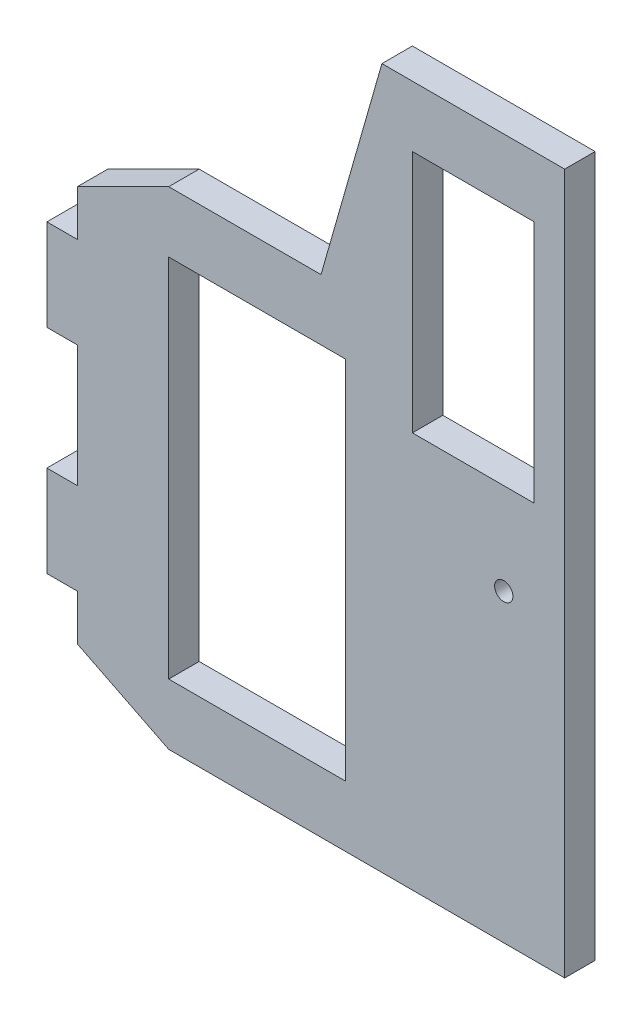
ISO-10303-21;
HEADER;
FILE_DESCRIPTION(('STEP AP214'),'2;1');
FILE_NAME('part.step','',(''),(''),'','','');
FILE_SCHEMA(('AUTOMOTIVE_DESIGN { 1 0 10303 214 1 1 1 1 }'));
ENDSEC;
DATA;
#1=APPLICATION_CONTEXT('core data for automotive mechanical design processes');
#2=APPLICATION_PROTOCOL_DEFINITION('international standard','automotive_design',2000,#1);
#3=PRODUCT_CONTEXT('',#1,'mechanical');
#4=PRODUCT('Part','Part','',(#3));
#5=PRODUCT_RELATED_PRODUCT_CATEGORY('part','',(#4));
#6=PRODUCT_DEFINITION_FORMATION('','',#4);
#7=PRODUCT_DEFINITION_CONTEXT('part definition',#1,'design');
#8=PRODUCT_DEFINITION('design','',#6,#7);
#9=PRODUCT_DEFINITION_SHAPE('','',#8);
#10=(LENGTH_UNIT() NAMED_UNIT(*) SI_UNIT(.MILLI.,.METRE.));
#11=(NAMED_UNIT(*) PLANE_ANGLE_UNIT() SI_UNIT($,.RADIAN.));
#12=(NAMED_UNIT(*) SI_UNIT($,.STERADIAN.) SOLID_ANGLE_UNIT());
#13=UNCERTAINTY_MEASURE_WITH_UNIT(LENGTH_MEASURE(1.E-05),#10,'distance_accuracy_value','');
#14=(GEOMETRIC_REPRESENTATION_CONTEXT(3) GLOBAL_UNCERTAINTY_ASSIGNED_CONTEXT((#13)) GLOBAL_UNIT_ASSIGNED_CONTEXT((#10,
#11,#12)) REPRESENTATION_CONTEXT('',''));
#15=CARTESIAN_POINT('',(0.,0.,0.));
#16=DIRECTION('',(0.,0.,1.));
#17=DIRECTION('',(1.,0.,0.));
#18=AXIS2_PLACEMENT_3D('',#15,#16,#17);
#19=CARTESIAN_POINT('',(-40.,31.7837837837838,5.));
#20=DIRECTION('',(1.,0.,0.));
#21=DIRECTION('',(0.,0.,-1.));
#22=AXIS2_PLACEMENT_3D('',#19,#20,#21);
#23=PLANE('',#22);
#24=DIRECTION('',(0.,-1.,0.));
#25=VECTOR('',#24,1.);
#26=CARTESIAN_POINT('',(-40.,31.7837837837838,0.));
#27=LINE('',#26,#25);
#28=CARTESIAN_POINT('',(-40.,-33.2162162162162,0.));
#29=VERTEX_POINT('',#28);
#30=CARTESIAN_POINT('',(-40.,-40.7162162162162,0.));
#31=VERTEX_POINT('',#30);
#32=EDGE_CURVE('E227',#29,#31,#27,.T.);
#33=ORIENTED_EDGE('',*,*,#32,.T.);
#34=DIRECTION('',(0.,0.,1.));
#35=VECTOR('',#34,1.);
#36=CARTESIAN_POINT('',(-40.,-40.7162162162162,0.));
#37=LINE('',#36,#35);
#38=CARTESIAN_POINT('',(-40.,-40.7162162162162,5.));
#39=VERTEX_POINT('',#38);
#40=EDGE_CURVE('E55',#31,#39,#37,.T.);
#41=ORIENTED_EDGE('',*,*,#40,.T.);
#42=DIRECTION('',(0.,-1.,0.));
#43=VECTOR('',#42,1.);
#44=CARTESIAN_POINT('',(-40.,31.7837837837838,5.));
#45=LINE('',#44,#43);
#46=CARTESIAN_POINT('',(-40.,-33.2162162162162,5.));
#47=VERTEX_POINT('',#46);
#48=EDGE_CURVE('E308',#47,#39,#45,.T.);
#49=ORIENTED_EDGE('',*,*,#48,.F.);
#50=DIRECTION('',(0.,0.,1.));
#51=VECTOR('',#50,1.);
#52=CARTESIAN_POINT('',(-40.,-33.2162162162162,0.));
#53=LINE('',#52,#51);
#54=EDGE_CURVE('E393',#29,#47,#53,.T.);
#55=ORIENTED_EDGE('',*,*,#54,.F.);
#56=EDGE_LOOP('',(#33,#41,#49,#55));
#57=FACE_BOUND('',#56,.T.);
#58=ADVANCED_FACE('F39',(#57),#23,.F.);
#59=DIRECTION('',(0.,0.,-1.));
#60=VECTOR('',#59,1.);
#61=CARTESIAN_POINT('',(-40.,-18.2162162162162,0.));
#62=LINE('',#61,#60);
#63=CARTESIAN_POINT('',(-40.,-18.2162162162162,5.));
#64=VERTEX_POINT('',#63);
#65=CARTESIAN_POINT('',(-40.,-18.2162162162162,0.));
#66=VERTEX_POINT('',#65);
#67=EDGE_CURVE('E383',#64,#66,#62,.T.);
#68=ORIENTED_EDGE('',*,*,#67,.F.);
#69=CARTESIAN_POINT('',(-40.,1.7837837837838,5.));
#70=VERTEX_POINT('',#69);
#71=EDGE_CURVE('E307',#70,#64,#45,.T.);
#72=ORIENTED_EDGE('',*,*,#71,.F.);
#73=DIRECTION('',(0.,0.,1.));
#74=VECTOR('',#73,1.);
#75=CARTESIAN_POINT('',(-40.,1.7837837837838,0.));
#76=LINE('',#75,#74);
#77=CARTESIAN_POINT('',(-40.,1.7837837837838,0.));
#78=VERTEX_POINT('',#77);
#79=EDGE_CURVE('E415',#78,#70,#76,.T.);
#80=ORIENTED_EDGE('',*,*,#79,.F.);
#81=EDGE_CURVE('E225',#78,#66,#27,.T.);
#82=ORIENTED_EDGE('',*,*,#81,.T.);
#83=EDGE_LOOP('',(#68,#72,#80,#82));
#84=FACE_BOUND('',#83,.T.);
#85=ADVANCED_FACE('F501',(#84),#23,.F.);
#86=CARTESIAN_POINT('',(-40.,24.2837837837838,5.));
#87=VERTEX_POINT('',#86);
#88=CARTESIAN_POINT('',(-40.,16.7837837837838,5.));
#89=VERTEX_POINT('',#88);
#90=EDGE_CURVE('E215',#87,#89,#45,.T.);
#91=ORIENTED_EDGE('',*,*,#90,.F.);
#92=DIRECTION('',(0.,0.,1.));
#93=VECTOR('',#92,1.);
#94=CARTESIAN_POINT('',(-40.,24.2837837837838,0.));
#95=LINE('',#94,#93);
#96=CARTESIAN_POINT('',(-40.,24.2837837837838,0.));
#97=VERTEX_POINT('',#96);
#98=EDGE_CURVE('E201',#97,#87,#95,.T.);
#99=ORIENTED_EDGE('',*,*,#98,.F.);
#100=CARTESIAN_POINT('',(-40.,16.7837837837838,0.));
#101=VERTEX_POINT('',#100);
#102=EDGE_CURVE('E213',#97,#101,#27,.T.);
#103=ORIENTED_EDGE('',*,*,#102,.T.);
#104=DIRECTION('',(0.,0.,-1.));
#105=VECTOR('',#104,1.);
#106=CARTESIAN_POINT('',(-40.,16.7837837837838,0.));
#107=LINE('',#106,#105);
#108=EDGE_CURVE('E421',#89,#101,#107,.T.);
#109=ORIENTED_EDGE('',*,*,#108,.F.);
#110=EDGE_LOOP('',(#91,#99,#103,#109));
#111=FACE_BOUND('',#110,.T.);
#112=ADVANCED_FACE('F41',(#111),#23,.F.);
#113=CARTESIAN_POINT('',(-40.,-48.2162162162162,5.));
#114=DIRECTION('',(0.,1.,0.));
#115=DIRECTION('',(0.,0.,1.));
#116=AXIS2_PLACEMENT_3D('',#113,#114,#115);
#117=PLANE('',#116);
#118=DIRECTION('',(1.,0.,0.));
#119=VECTOR('',#118,1.);
#120=CARTESIAN_POINT('',(-40.,-48.2162162162162,5.));
#121=LINE('',#120,#119);
#122=CARTESIAN_POINT('',(-25.,-48.2162162162162,5.));
#123=VERTEX_POINT('',#122);
#124=CARTESIAN_POINT('',(40.,-48.2162162162162,5.));
#125=VERTEX_POINT('',#124);
#126=EDGE_CURVE('E306',#123,#125,#121,.T.);
#127=ORIENTED_EDGE('',*,*,#126,.F.);
#128=DIRECTION('',(0.,0.,1.));
#129=VECTOR('',#128,1.);
#130=CARTESIAN_POINT('',(-25.,-48.2162162162162,0.));
#131=LINE('',#130,#129);
#132=CARTESIAN_POINT('',(-25.,-48.2162162162162,0.));
#133=VERTEX_POINT('',#132);
#134=EDGE_CURVE('E363',#133,#123,#131,.T.);
#135=ORIENTED_EDGE('',*,*,#134,.F.);
#136=DIRECTION('',(1.,0.,0.));
#137=VECTOR('',#136,1.);
#138=CARTESIAN_POINT('',(-40.,-48.2162162162162,0.));
#139=LINE('',#138,#137);
#140=CARTESIAN_POINT('',(40.,-48.2162162162162,0.));
#141=VERTEX_POINT('',#140);
#142=EDGE_CURVE('E224',#133,#141,#139,.T.);
#143=ORIENTED_EDGE('',*,*,#142,.T.);
#144=DIRECTION('',(0.,0.,-1.));
#145=VECTOR('',#144,1.);
#146=CARTESIAN_POINT('',(40.,-48.2162162162162,5.));
#147=LINE('',#146,#145);
#148=EDGE_CURVE('E11',#125,#141,#147,.T.);
#149=ORIENTED_EDGE('',*,*,#148,.F.);
#150=EDGE_LOOP('',(#127,#135,#143,#149));
#151=FACE_BOUND('',#150,.T.);
#152=ADVANCED_FACE('F361',(#151),#117,.F.);
#153=CARTESIAN_POINT('',(40.,21.7837837837838,5.));
#154=DIRECTION('',(-1.,0.,0.));
#155=DIRECTION('',(0.,-1.,0.));
#156=AXIS2_PLACEMENT_3D('',#153,#154,#155);
#157=PLANE('',#156);
#158=DIRECTION('',(0.,1.,0.));
#159=VECTOR('',#158,1.);
#160=CARTESIAN_POINT('',(40.,21.7837837837838,0.));
#161=LINE('',#160,#159);
#162=CARTESIAN_POINT('',(40.,66.7837837837838,0.));
#163=VERTEX_POINT('',#162);
#164=EDGE_CURVE('E230',#141,#163,#161,.T.);
#165=ORIENTED_EDGE('',*,*,#164,.T.);
#166=DIRECTION('',(0.,0.,-1.));
#167=VECTOR('',#166,1.);
#168=CARTESIAN_POINT('',(40.,66.7837837837838,5.));
#169=LINE('',#168,#167);
#170=CARTESIAN_POINT('',(40.,66.7837837837838,5.));
#171=VERTEX_POINT('',#170);
#172=EDGE_CURVE('E48',#171,#163,#169,.T.);
#173=ORIENTED_EDGE('',*,*,#172,.F.);
#174=DIRECTION('',(0.,1.,0.));
#175=VECTOR('',#174,1.);
#176=CARTESIAN_POINT('',(40.,21.7837837837838,5.));
#177=LINE('',#176,#175);
#178=EDGE_CURVE('E311',#125,#171,#177,.T.);
#179=ORIENTED_EDGE('',*,*,#178,.F.);
#180=ORIENTED_EDGE('',*,*,#148,.T.);
#181=EDGE_LOOP('',(#165,#173,#179,#180));
#182=FACE_BOUND('',#181,.T.);
#183=ADVANCED_FACE('F357',(#182),#157,.F.);
#184=CARTESIAN_POINT('',(40.,66.7837837837838,5.));
#185=DIRECTION('',(0.,-1.,0.));
#186=DIRECTION('',(0.,0.,-1.));
#187=AXIS2_PLACEMENT_3D('',#184,#185,#186);
#188=PLANE('',#187);
#189=DIRECTION('',(-1.,0.,0.));
#190=VECTOR('',#189,1.);
#191=CARTESIAN_POINT('',(40.,66.7837837837838,0.));
#192=LINE('',#191,#190);
#193=CARTESIAN_POINT('',(9.99999999999999,66.7837837837838,0.));
#194=VERTEX_POINT('',#193);
#195=EDGE_CURVE('E345',#163,#194,#192,.T.);
#196=ORIENTED_EDGE('',*,*,#195,.T.);
#197=DIRECTION('',(0.,0.,-1.));
#198=VECTOR('',#197,1.);
#199=CARTESIAN_POINT('',(9.99999999999999,66.7837837837838,5.));
#200=LINE('',#199,#198);
#201=CARTESIAN_POINT('',(9.99999999999999,66.7837837837838,5.));
#202=VERTEX_POINT('',#201);
#203=EDGE_CURVE('E327',#202,#194,#200,.T.);
#204=ORIENTED_EDGE('',*,*,#203,.F.);
#205=DIRECTION('',(-1.,0.,0.));
#206=VECTOR('',#205,1.);
#207=CARTESIAN_POINT('',(40.,66.7837837837838,5.));
#208=LINE('',#207,#206);
#209=EDGE_CURVE('E314',#171,#202,#208,.T.);
#210=ORIENTED_EDGE('',*,*,#209,.F.);
#211=ORIENTED_EDGE('',*,*,#172,.T.);
#212=EDGE_LOOP('',(#196,#204,#210,#211));
#213=FACE_BOUND('',#212,.T.);
#214=ADVANCED_FACE('F343',(#213),#188,.F.);
#215=CARTESIAN_POINT('',(0.,31.7837837837838,5.));
#216=DIRECTION('',(0.961523947640823,-0.274721127897378,0.));
#217=DIRECTION('',(0.274721127897378,0.961523947640823,0.));
#218=AXIS2_PLACEMENT_3D('',#215,#216,#217);
#219=PLANE('',#218);
#220=DIRECTION('',(-0.274721127897378,-0.961523947640823,0.));
#221=VECTOR('',#220,1.);
#222=CARTESIAN_POINT('',(0.,31.7837837837838,0.));
#223=LINE('',#222,#221);
#224=CARTESIAN_POINT('',(0.,31.7837837837838,0.));
#225=VERTEX_POINT('',#224);
#226=EDGE_CURVE('E351',#194,#225,#223,.T.);
#227=ORIENTED_EDGE('',*,*,#226,.T.);
#228=DIRECTION('',(0.,0.,-1.));
#229=VECTOR('',#228,1.);
#230=CARTESIAN_POINT('',(0.,31.7837837837838,5.));
#231=LINE('',#230,#229);
#232=CARTESIAN_POINT('',(0.,31.7837837837838,5.));
#233=VERTEX_POINT('',#232);
#234=EDGE_CURVE('E322',#233,#225,#231,.T.);
#235=ORIENTED_EDGE('',*,*,#234,.F.);
#236=DIRECTION('',(-0.274721127897378,-0.961523947640823,0.));
#237=VECTOR('',#236,1.);
#238=CARTESIAN_POINT('',(0.,31.7837837837838,5.));
#239=LINE('',#238,#237);
#240=EDGE_CURVE('E317',#202,#233,#239,.T.);
#241=ORIENTED_EDGE('',*,*,#240,.F.);
#242=ORIENTED_EDGE('',*,*,#203,.T.);
#243=EDGE_LOOP('',(#227,#235,#241,#242));
#244=FACE_BOUND('',#243,.T.);
#245=ADVANCED_FACE('F517',(#244),#219,.F.);
#246=CARTESIAN_POINT('',(-40.,31.7837837837838,5.));
#247=DIRECTION('',(0.,-1.,0.));
#248=DIRECTION('',(0.,0.,-1.));
#249=AXIS2_PLACEMENT_3D('',#246,#247,#248);
#250=PLANE('',#249);
#251=DIRECTION('',(-1.,0.,0.));
#252=VECTOR('',#251,1.);
#253=CARTESIAN_POINT('',(-40.,31.7837837837838,0.));
#254=LINE('',#253,#252);
#255=CARTESIAN_POINT('',(-25.,31.7837837837838,0.));
#256=VERTEX_POINT('',#255);
#257=EDGE_CURVE('E335',#225,#256,#254,.T.);
#258=ORIENTED_EDGE('',*,*,#257,.T.);
#259=DIRECTION('',(0.,0.,1.));
#260=VECTOR('',#259,1.);
#261=CARTESIAN_POINT('',(-25.,31.7837837837838,0.));
#262=LINE('',#261,#260);
#263=CARTESIAN_POINT('',(-25.,31.7837837837838,5.));
#264=VERTEX_POINT('',#263);
#265=EDGE_CURVE('E63',#256,#264,#262,.T.);
#266=ORIENTED_EDGE('',*,*,#265,.T.);
#267=DIRECTION('',(-1.,0.,0.));
#268=VECTOR('',#267,1.);
#269=CARTESIAN_POINT('',(-40.,31.7837837837838,5.));
#270=LINE('',#269,#268);
#271=EDGE_CURVE('E319',#233,#264,#270,.T.);
#272=ORIENTED_EDGE('',*,*,#271,.F.);
#273=ORIENTED_EDGE('',*,*,#234,.T.);
#274=EDGE_LOOP('',(#258,#266,#272,#273));
#275=FACE_BOUND('',#274,.T.);
#276=ADVANCED_FACE('F520',(#275),#250,.F.);
#277=CARTESIAN_POINT('',(0.,0.,5.));
#278=DIRECTION('',(0.,0.,1.));
#279=DIRECTION('',(1.,0.,0.));
#280=AXIS2_PLACEMENT_3D('',#277,#278,#279);
#281=PLANE('',#280);
#282=CARTESIAN_POINT('',(30.,1.7837837837838,5.));
#283=DIRECTION('',(0.,0.,1.));
#284=DIRECTION('',(1.,0.,0.));
#285=AXIS2_PLACEMENT_3D('',#282,#283,#284);
#286=CIRCLE('',#285,1.5);
#287=CARTESIAN_POINT('',(31.5,1.7837837837838,5.));
#288=VERTEX_POINT('',#287);
#289=EDGE_CURVE('E701',#288,#288,#286,.T.);
#290=ORIENTED_EDGE('',*,*,#289,.F.);
#291=EDGE_LOOP('',(#290));
#292=FACE_BOUND('',#291,.T.);
#293=DIRECTION('',(0.894427190999916,0.447213595499958,0.));
#294=VECTOR('',#293,1.);
#295=CARTESIAN_POINT('',(-25.,31.7837837837838,5.));
#296=LINE('',#295,#294);
#297=EDGE_CURVE('E208',#87,#264,#296,.T.);
#298=ORIENTED_EDGE('',*,*,#297,.F.);
#299=ORIENTED_EDGE('',*,*,#90,.T.);
#300=DIRECTION('',(1.,0.,0.));
#301=VECTOR('',#300,1.);
#302=CARTESIAN_POINT('',(-45.,16.7837837837838,5.));
#303=LINE('',#302,#301);
#304=CARTESIAN_POINT('',(-45.,16.7837837837838,5.));
#305=VERTEX_POINT('',#304);
#306=EDGE_CURVE('E437',#305,#89,#303,.T.);
#307=ORIENTED_EDGE('',*,*,#306,.F.);
#308=DIRECTION('',(0.,1.,0.));
#309=VECTOR('',#308,1.);
#310=CARTESIAN_POINT('',(-45.,16.7837837837838,5.));
#311=LINE('',#310,#309);
#312=CARTESIAN_POINT('',(-45.,1.7837837837838,5.));
#313=VERTEX_POINT('',#312);
#314=EDGE_CURVE('E424',#313,#305,#311,.T.);
#315=ORIENTED_EDGE('',*,*,#314,.F.);
#316=DIRECTION('',(1.,0.,0.));
#317=VECTOR('',#316,1.);
#318=CARTESIAN_POINT('',(-45.,1.7837837837838,5.));
#319=LINE('',#318,#317);
#320=EDGE_CURVE('E441',#313,#70,#319,.T.);
#321=ORIENTED_EDGE('',*,*,#320,.T.);
#322=ORIENTED_EDGE('',*,*,#71,.T.);
#323=DIRECTION('',(1.,0.,0.));
#324=VECTOR('',#323,1.);
#325=CARTESIAN_POINT('',(-45.,-18.2162162162162,5.));
#326=LINE('',#325,#324);
#327=CARTESIAN_POINT('',(-45.,-18.2162162162162,5.));
#328=VERTEX_POINT('',#327);
#329=EDGE_CURVE('E403',#328,#64,#326,.T.);
#330=ORIENTED_EDGE('',*,*,#329,.F.);
#331=DIRECTION('',(0.,1.,0.));
#332=VECTOR('',#331,1.);
#333=CARTESIAN_POINT('',(-45.,-18.2162162162162,5.));
#334=LINE('',#333,#332);
#335=CARTESIAN_POINT('',(-45.,-33.2162162162162,5.));
#336=VERTEX_POINT('',#335);
#337=EDGE_CURVE('E386',#336,#328,#334,.T.);
#338=ORIENTED_EDGE('',*,*,#337,.F.);
#339=DIRECTION('',(1.,0.,0.));
#340=VECTOR('',#339,1.);
#341=CARTESIAN_POINT('',(-45.,-33.2162162162162,5.));
#342=LINE('',#341,#340);
#343=EDGE_CURVE('E407',#336,#47,#342,.T.);
#344=ORIENTED_EDGE('',*,*,#343,.T.);
#345=ORIENTED_EDGE('',*,*,#48,.T.);
#346=DIRECTION('',(-0.894427190999916,0.447213595499958,0.));
#347=VECTOR('',#346,1.);
#348=CARTESIAN_POINT('',(-40.,-40.7162162162162,5.));
#349=LINE('',#348,#347);
#350=EDGE_CURVE('E367',#123,#39,#349,.T.);
#351=ORIENTED_EDGE('',*,*,#350,.F.);
#352=ORIENTED_EDGE('',*,*,#126,.T.);
#353=ORIENTED_EDGE('',*,*,#178,.T.);
#354=ORIENTED_EDGE('',*,*,#209,.T.);
#355=ORIENTED_EDGE('',*,*,#240,.T.);
#356=ORIENTED_EDGE('',*,*,#271,.T.);
#357=EDGE_LOOP('',(#298,#299,#307,#315,#321,#322,#330,#338,#344,#345,#351,#352,#353,#354,#355,#356));
#358=FACE_BOUND('',#357,.T.);
#359=DIRECTION('',(0.,-1.,0.));
#360=VECTOR('',#359,1.);
#361=CARTESIAN_POINT('',(-25.,21.7837837837838,5.));
#362=LINE('',#361,#360);
#363=CARTESIAN_POINT('',(-25.,21.7837837837838,5.));
#364=VERTEX_POINT('',#363);
#365=CARTESIAN_POINT('',(-25.,-38.2162162162162,5.));
#366=VERTEX_POINT('',#365);
#367=EDGE_CURVE('E294',#364,#366,#362,.T.);
#368=ORIENTED_EDGE('',*,*,#367,.F.);
#369=DIRECTION('',(-1.,0.,0.));
#370=VECTOR('',#369,1.);
#371=CARTESIAN_POINT('',(-25.,21.7837837837838,5.));
#372=LINE('',#371,#370);
#373=CARTESIAN_POINT('',(4.,21.7837837837838,5.));
#374=VERTEX_POINT('',#373);
#375=EDGE_CURVE('E248',#374,#364,#372,.T.);
#376=ORIENTED_EDGE('',*,*,#375,.F.);
#377=DIRECTION('',(0.,1.,0.));
#378=VECTOR('',#377,1.);
#379=CARTESIAN_POINT('',(4.,21.7837837837838,5.));
#380=LINE('',#379,#378);
#381=CARTESIAN_POINT('',(4.,-38.2162162162162,5.));
#382=VERTEX_POINT('',#381);
#383=EDGE_CURVE('E468',#382,#374,#380,.T.);
#384=ORIENTED_EDGE('',*,*,#383,.F.);
#385=DIRECTION('',(1.,0.,0.));
#386=VECTOR('',#385,1.);
#387=CARTESIAN_POINT('',(-25.,-38.2162162162162,5.));
#388=LINE('',#387,#386);
#389=EDGE_CURVE('E465',#366,#382,#388,.T.);
#390=ORIENTED_EDGE('',*,*,#389,.F.);
#391=EDGE_LOOP('',(#368,#376,#384,#390));
#392=FACE_BOUND('',#391,.T.);
#393=DIRECTION('',(0.,-1.,0.));
#394=VECTOR('',#393,1.);
#395=CARTESIAN_POINT('',(15.,56.7837837837838,5.));
#396=LINE('',#395,#394);
#397=CARTESIAN_POINT('',(15.,56.7837837837838,5.));
#398=VERTEX_POINT('',#397);
#399=CARTESIAN_POINT('',(15.,16.7837837837838,5.));
#400=VERTEX_POINT('',#399);
#401=EDGE_CURVE('E276',#398,#400,#396,.T.);
#402=ORIENTED_EDGE('',*,*,#401,.F.);
#403=DIRECTION('',(-1.,0.,0.));
#404=VECTOR('',#403,1.);
#405=CARTESIAN_POINT('',(15.,56.7837837837838,5.));
#406=LINE('',#405,#404);
#407=CARTESIAN_POINT('',(35.,56.7837837837838,5.));
#408=VERTEX_POINT('',#407);
#409=EDGE_CURVE('E263',#408,#398,#406,.T.);
#410=ORIENTED_EDGE('',*,*,#409,.F.);
#411=DIRECTION('',(0.,1.,0.));
#412=VECTOR('',#411,1.);
#413=CARTESIAN_POINT('',(35.,56.7837837837838,5.));
#414=LINE('',#413,#412);
#415=CARTESIAN_POINT('',(35.,16.7837837837838,5.));
#416=VERTEX_POINT('',#415);
#417=EDGE_CURVE('E284',#416,#408,#414,.T.);
#418=ORIENTED_EDGE('',*,*,#417,.F.);
#419=DIRECTION('',(1.,0.,0.));
#420=VECTOR('',#419,1.);
#421=CARTESIAN_POINT('',(15.,16.7837837837838,5.));
#422=LINE('',#421,#420);
#423=EDGE_CURVE('E279',#400,#416,#422,.T.);
#424=ORIENTED_EDGE('',*,*,#423,.F.);
#425=EDGE_LOOP('',(#402,#410,#418,#424));
#426=FACE_BOUND('',#425,.T.);
#427=ADVANCED_FACE('F481',(#292,#358,#392,#426),#281,.T.);
#428=CARTESIAN_POINT('',(0.,0.,0.));
#429=DIRECTION('',(0.,0.,1.));
#430=DIRECTION('',(1.,0.,0.));
#431=AXIS2_PLACEMENT_3D('',#428,#429,#430);
#432=PLANE('',#431);
#433=CARTESIAN_POINT('',(30.,1.7837837837838,0.));
#434=DIRECTION('',(0.,0.,1.));
#435=DIRECTION('',(1.,0.,0.));
#436=AXIS2_PLACEMENT_3D('',#433,#434,#435);
#437=CIRCLE('',#436,1.5);
#438=CARTESIAN_POINT('',(31.5,1.7837837837838,0.));
#439=VERTEX_POINT('',#438);
#440=EDGE_CURVE('E372',#439,#439,#437,.T.);
#441=ORIENTED_EDGE('',*,*,#440,.T.);
#442=EDGE_LOOP('',(#441));
#443=FACE_BOUND('',#442,.T.);
#444=DIRECTION('',(-1.,0.,0.));
#445=VECTOR('',#444,1.);
#446=CARTESIAN_POINT('',(-25.,21.7837837837838,0.));
#447=LINE('',#446,#445);
#448=CARTESIAN_POINT('',(4.,21.7837837837838,0.));
#449=VERTEX_POINT('',#448);
#450=CARTESIAN_POINT('',(-25.,21.7837837837838,0.));
#451=VERTEX_POINT('',#450);
#452=EDGE_CURVE('E257',#449,#451,#447,.T.);
#453=ORIENTED_EDGE('',*,*,#452,.T.);
#454=DIRECTION('',(0.,-1.,0.));
#455=VECTOR('',#454,1.);
#456=CARTESIAN_POINT('',(-25.,21.7837837837838,0.));
#457=LINE('',#456,#455);
#458=CARTESIAN_POINT('',(-25.,-38.2162162162162,0.));
#459=VERTEX_POINT('',#458);
#460=EDGE_CURVE('E448',#451,#459,#457,.T.);
#461=ORIENTED_EDGE('',*,*,#460,.T.);
#462=DIRECTION('',(1.,0.,0.));
#463=VECTOR('',#462,1.);
#464=CARTESIAN_POINT('',(-25.,-38.2162162162162,0.));
#465=LINE('',#464,#463);
#466=CARTESIAN_POINT('',(4.,-38.2162162162162,0.));
#467=VERTEX_POINT('',#466);
#468=EDGE_CURVE('E452',#459,#467,#465,.T.);
#469=ORIENTED_EDGE('',*,*,#468,.T.);
#470=DIRECTION('',(0.,1.,0.));
#471=VECTOR('',#470,1.);
#472=CARTESIAN_POINT('',(4.,21.7837837837838,0.));
#473=LINE('',#472,#471);
#474=EDGE_CURVE('E456',#467,#449,#473,.T.);
#475=ORIENTED_EDGE('',*,*,#474,.T.);
#476=EDGE_LOOP('',(#453,#461,#469,#475));
#477=FACE_BOUND('',#476,.T.);
#478=DIRECTION('',(-1.,0.,0.));
#479=VECTOR('',#478,1.);
#480=CARTESIAN_POINT('',(15.,56.7837837837838,0.));
#481=LINE('',#480,#479);
#482=CARTESIAN_POINT('',(35.,56.7837837837838,0.));
#483=VERTEX_POINT('',#482);
#484=CARTESIAN_POINT('',(15.,56.7837837837838,0.));
#485=VERTEX_POINT('',#484);
#486=EDGE_CURVE('E271',#483,#485,#481,.T.);
#487=ORIENTED_EDGE('',*,*,#486,.T.);
#488=DIRECTION('',(0.,-1.,0.));
#489=VECTOR('',#488,1.);
#490=CARTESIAN_POINT('',(15.,56.7837837837838,0.));
#491=LINE('',#490,#489);
#492=CARTESIAN_POINT('',(15.,16.7837837837838,0.));
#493=VERTEX_POINT('',#492);
#494=EDGE_CURVE('E258',#485,#493,#491,.T.);
#495=ORIENTED_EDGE('',*,*,#494,.T.);
#496=DIRECTION('',(1.,0.,0.));
#497=VECTOR('',#496,1.);
#498=CARTESIAN_POINT('',(15.,16.7837837837838,0.));
#499=LINE('',#498,#497);
#500=CARTESIAN_POINT('',(35.,16.7837837837838,0.));
#501=VERTEX_POINT('',#500);
#502=EDGE_CURVE('E262',#493,#501,#499,.T.);
#503=ORIENTED_EDGE('',*,*,#502,.T.);
#504=DIRECTION('',(0.,1.,0.));
#505=VECTOR('',#504,1.);
#506=CARTESIAN_POINT('',(35.,56.7837837837838,0.));
#507=LINE('',#506,#505);
#508=EDGE_CURVE('E267',#501,#483,#507,.T.);
#509=ORIENTED_EDGE('',*,*,#508,.T.);
#510=EDGE_LOOP('',(#487,#495,#503,#509));
#511=FACE_BOUND('',#510,.T.);
#512=ORIENTED_EDGE('',*,*,#102,.F.);
#513=DIRECTION('',(0.894427190999916,0.447213595499958,0.));
#514=VECTOR('',#513,1.);
#515=CARTESIAN_POINT('',(-25.,31.7837837837838,0.));
#516=LINE('',#515,#514);
#517=EDGE_CURVE('E198',#97,#256,#516,.T.);
#518=ORIENTED_EDGE('',*,*,#517,.T.);
#519=ORIENTED_EDGE('',*,*,#257,.F.);
#520=ORIENTED_EDGE('',*,*,#226,.F.);
#521=ORIENTED_EDGE('',*,*,#195,.F.);
#522=ORIENTED_EDGE('',*,*,#164,.F.);
#523=ORIENTED_EDGE('',*,*,#142,.F.);
#524=DIRECTION('',(-0.894427190999916,0.447213595499958,0.));
#525=VECTOR('',#524,1.);
#526=CARTESIAN_POINT('',(-40.,-40.7162162162162,0.));
#527=LINE('',#526,#525);
#528=EDGE_CURVE('E364',#133,#31,#527,.T.);
#529=ORIENTED_EDGE('',*,*,#528,.T.);
#530=ORIENTED_EDGE('',*,*,#32,.F.);
#531=DIRECTION('',(1.,0.,0.));
#532=VECTOR('',#531,1.);
#533=CARTESIAN_POINT('',(-45.,-33.2162162162162,0.));
#534=LINE('',#533,#532);
#535=CARTESIAN_POINT('',(-45.,-33.2162162162162,0.));
#536=VERTEX_POINT('',#535);
#537=EDGE_CURVE('E411',#536,#29,#534,.T.);
#538=ORIENTED_EDGE('',*,*,#537,.F.);
#539=DIRECTION('',(0.,-1.,0.));
#540=VECTOR('',#539,1.);
#541=CARTESIAN_POINT('',(-45.,-18.2162162162162,0.));
#542=LINE('',#541,#540);
#543=CARTESIAN_POINT('',(-45.,-18.2162162162162,0.));
#544=VERTEX_POINT('',#543);
#545=EDGE_CURVE('E378',#544,#536,#542,.T.);
#546=ORIENTED_EDGE('',*,*,#545,.F.);
#547=DIRECTION('',(1.,0.,0.));
#548=VECTOR('',#547,1.);
#549=CARTESIAN_POINT('',(-45.,-18.2162162162162,0.));
#550=LINE('',#549,#548);
#551=EDGE_CURVE('E392',#544,#66,#550,.T.);
#552=ORIENTED_EDGE('',*,*,#551,.T.);
#553=ORIENTED_EDGE('',*,*,#81,.F.);
#554=DIRECTION('',(1.,0.,0.));
#555=VECTOR('',#554,1.);
#556=CARTESIAN_POINT('',(-45.,1.7837837837838,0.));
#557=LINE('',#556,#555);
#558=CARTESIAN_POINT('',(-45.,1.7837837837838,0.));
#559=VERTEX_POINT('',#558);
#560=EDGE_CURVE('E280',#559,#78,#557,.T.);
#561=ORIENTED_EDGE('',*,*,#560,.F.);
#562=DIRECTION('',(0.,-1.,0.));
#563=VECTOR('',#562,1.);
#564=CARTESIAN_POINT('',(-45.,16.7837837837838,0.));
#565=LINE('',#564,#563);
#566=CARTESIAN_POINT('',(-45.,16.7837837837838,0.));
#567=VERTEX_POINT('',#566);
#568=EDGE_CURVE('E416',#567,#559,#565,.T.);
#569=ORIENTED_EDGE('',*,*,#568,.F.);
#570=DIRECTION('',(1.,0.,0.));
#571=VECTOR('',#570,1.);
#572=CARTESIAN_POINT('',(-45.,16.7837837837838,0.));
#573=LINE('',#572,#571);
#574=EDGE_CURVE('E222',#567,#101,#573,.T.);
#575=ORIENTED_EDGE('',*,*,#574,.T.);
#576=EDGE_LOOP('',(#512,#518,#519,#520,#521,#522,#523,#529,#530,#538,#546,#552,#553,#561,#569,#575));
#577=FACE_BOUND('',#576,.T.);
#578=ADVANCED_FACE('F219',(#443,#477,#511,#577),#432,.F.);
#579=CARTESIAN_POINT('',(15.,56.7837837837838,0.));
#580=DIRECTION('',(-1.,0.,0.));
#581=DIRECTION('',(0.,-1.,0.));
#582=AXIS2_PLACEMENT_3D('',#579,#580,#581);
#583=PLANE('',#582);
#584=ORIENTED_EDGE('',*,*,#401,.T.);
#585=DIRECTION('',(0.,0.,1.));
#586=VECTOR('',#585,1.);
#587=CARTESIAN_POINT('',(15.,16.7837837837838,0.));
#588=LINE('',#587,#586);
#589=EDGE_CURVE('E275',#493,#400,#588,.T.);
#590=ORIENTED_EDGE('',*,*,#589,.F.);
#591=ORIENTED_EDGE('',*,*,#494,.F.);
#592=DIRECTION('',(0.,0.,1.));
#593=VECTOR('',#592,1.);
#594=CARTESIAN_POINT('',(15.,56.7837837837838,0.));
#595=LINE('',#594,#593);
#596=EDGE_CURVE('E291',#485,#398,#595,.T.);
#597=ORIENTED_EDGE('',*,*,#596,.T.);
#598=EDGE_LOOP('',(#584,#590,#591,#597));
#599=FACE_BOUND('',#598,.T.);
#600=ADVANCED_FACE('F526',(#599),#583,.F.);
#601=CARTESIAN_POINT('',(15.,56.7837837837838,0.));
#602=DIRECTION('',(0.,1.,0.));
#603=DIRECTION('',(0.,0.,1.));
#604=AXIS2_PLACEMENT_3D('',#601,#602,#603);
#605=PLANE('',#604);
#606=ORIENTED_EDGE('',*,*,#409,.T.);
#607=ORIENTED_EDGE('',*,*,#596,.F.);
#608=ORIENTED_EDGE('',*,*,#486,.F.);
#609=DIRECTION('',(0.,0.,1.));
#610=VECTOR('',#609,1.);
#611=CARTESIAN_POINT('',(35.,56.7837837837838,0.));
#612=LINE('',#611,#610);
#613=EDGE_CURVE('E295',#483,#408,#612,.T.);
#614=ORIENTED_EDGE('',*,*,#613,.T.);
#615=EDGE_LOOP('',(#606,#607,#608,#614));
#616=FACE_BOUND('',#615,.T.);
#617=ADVANCED_FACE('F533',(#616),#605,.F.);
#618=CARTESIAN_POINT('',(35.,56.7837837837838,0.));
#619=DIRECTION('',(1.,0.,0.));
#620=DIRECTION('',(0.,1.,0.));
#621=AXIS2_PLACEMENT_3D('',#618,#619,#620);
#622=PLANE('',#621);
#623=ORIENTED_EDGE('',*,*,#417,.T.);
#624=ORIENTED_EDGE('',*,*,#613,.F.);
#625=ORIENTED_EDGE('',*,*,#508,.F.);
#626=DIRECTION('',(0.,0.,1.));
#627=VECTOR('',#626,1.);
#628=CARTESIAN_POINT('',(35.,16.7837837837838,0.));
#629=LINE('',#628,#627);
#630=EDGE_CURVE('E298',#501,#416,#629,.T.);
#631=ORIENTED_EDGE('',*,*,#630,.T.);
#632=EDGE_LOOP('',(#623,#624,#625,#631));
#633=FACE_BOUND('',#632,.T.);
#634=ADVANCED_FACE('F538',(#633),#622,.F.);
#635=CARTESIAN_POINT('',(15.,16.7837837837838,0.));
#636=DIRECTION('',(0.,-1.,0.));
#637=DIRECTION('',(0.,0.,-1.));
#638=AXIS2_PLACEMENT_3D('',#635,#636,#637);
#639=PLANE('',#638);
#640=ORIENTED_EDGE('',*,*,#423,.T.);
#641=ORIENTED_EDGE('',*,*,#630,.F.);
#642=ORIENTED_EDGE('',*,*,#502,.F.);
#643=ORIENTED_EDGE('',*,*,#589,.T.);
#644=EDGE_LOOP('',(#640,#641,#642,#643));
#645=FACE_BOUND('',#644,.T.);
#646=ADVANCED_FACE('F535',(#645),#639,.F.);
#647=CARTESIAN_POINT('',(-25.,21.7837837837838,0.));
#648=DIRECTION('',(-1.,0.,0.));
#649=DIRECTION('',(0.,-1.,0.));
#650=AXIS2_PLACEMENT_3D('',#647,#648,#649);
#651=PLANE('',#650);
#652=ORIENTED_EDGE('',*,*,#367,.T.);
#653=DIRECTION('',(0.,0.,1.));
#654=VECTOR('',#653,1.);
#655=CARTESIAN_POINT('',(-25.,-38.2162162162162,0.));
#656=LINE('',#655,#654);
#657=EDGE_CURVE('E253',#459,#366,#656,.T.);
#658=ORIENTED_EDGE('',*,*,#657,.F.);
#659=ORIENTED_EDGE('',*,*,#460,.F.);
#660=DIRECTION('',(0.,0.,1.));
#661=VECTOR('',#660,1.);
#662=CARTESIAN_POINT('',(-25.,21.7837837837838,0.));
#663=LINE('',#662,#661);
#664=EDGE_CURVE('E235',#451,#364,#663,.T.);
#665=ORIENTED_EDGE('',*,*,#664,.T.);
#666=EDGE_LOOP('',(#652,#658,#659,#665));
#667=FACE_BOUND('',#666,.T.);
#668=ADVANCED_FACE('F483',(#667),#651,.F.);
#669=CARTESIAN_POINT('',(-25.,21.7837837837838,0.));
#670=DIRECTION('',(0.,1.,0.));
#671=DIRECTION('',(0.,0.,1.));
#672=AXIS2_PLACEMENT_3D('',#669,#670,#671);
#673=PLANE('',#672);
#674=ORIENTED_EDGE('',*,*,#375,.T.);
#675=ORIENTED_EDGE('',*,*,#664,.F.);
#676=ORIENTED_EDGE('',*,*,#452,.F.);
#677=DIRECTION('',(0.,0.,1.));
#678=VECTOR('',#677,1.);
#679=CARTESIAN_POINT('',(4.,21.7837837837838,0.));
#680=LINE('',#679,#678);
#681=EDGE_CURVE('E239',#449,#374,#680,.T.);
#682=ORIENTED_EDGE('',*,*,#681,.T.);
#683=EDGE_LOOP('',(#674,#675,#676,#682));
#684=FACE_BOUND('',#683,.T.);
#685=ADVANCED_FACE('F477',(#684),#673,.F.);
#686=CARTESIAN_POINT('',(4.,21.7837837837838,0.));
#687=DIRECTION('',(1.,0.,0.));
#688=DIRECTION('',(0.,1.,0.));
#689=AXIS2_PLACEMENT_3D('',#686,#687,#688);
#690=PLANE('',#689);
#691=ORIENTED_EDGE('',*,*,#383,.T.);
#692=ORIENTED_EDGE('',*,*,#681,.F.);
#693=ORIENTED_EDGE('',*,*,#474,.F.);
#694=DIRECTION('',(0.,0.,1.));
#695=VECTOR('',#694,1.);
#696=CARTESIAN_POINT('',(4.,-38.2162162162162,0.));
#697=LINE('',#696,#695);
#698=EDGE_CURVE('E245',#467,#382,#697,.T.);
#699=ORIENTED_EDGE('',*,*,#698,.T.);
#700=EDGE_LOOP('',(#691,#692,#693,#699));
#701=FACE_BOUND('',#700,.T.);
#702=ADVANCED_FACE('F490',(#701),#690,.F.);
#703=CARTESIAN_POINT('',(-25.,-38.2162162162162,0.));
#704=DIRECTION('',(0.,-1.,0.));
#705=DIRECTION('',(0.,0.,-1.));
#706=AXIS2_PLACEMENT_3D('',#703,#704,#705);
#707=PLANE('',#706);
#708=ORIENTED_EDGE('',*,*,#389,.T.);
#709=ORIENTED_EDGE('',*,*,#698,.F.);
#710=ORIENTED_EDGE('',*,*,#468,.F.);
#711=ORIENTED_EDGE('',*,*,#657,.T.);
#712=EDGE_LOOP('',(#708,#709,#710,#711));
#713=FACE_BOUND('',#712,.T.);
#714=ADVANCED_FACE('F486',(#713),#707,.F.);
#715=CARTESIAN_POINT('',(-45.,1.7837837837838,0.));
#716=DIRECTION('',(0.,1.,0.));
#717=DIRECTION('',(-1.,0.,0.));
#718=AXIS2_PLACEMENT_3D('',#715,#716,#717);
#719=PLANE('',#718);
#720=ORIENTED_EDGE('',*,*,#79,.T.);
#721=ORIENTED_EDGE('',*,*,#320,.F.);
#722=DIRECTION('',(0.,0.,1.));
#723=VECTOR('',#722,1.);
#724=CARTESIAN_POINT('',(-45.,1.7837837837838,0.));
#725=LINE('',#724,#723);
#726=EDGE_CURVE('E420',#559,#313,#725,.T.);
#727=ORIENTED_EDGE('',*,*,#726,.F.);
#728=ORIENTED_EDGE('',*,*,#560,.T.);
#729=EDGE_LOOP('',(#720,#721,#727,#728));
#730=FACE_BOUND('',#729,.T.);
#731=ADVANCED_FACE('F497',(#730),#719,.F.);
#732=CARTESIAN_POINT('',(-45.,16.7837837837838,0.));
#733=DIRECTION('',(0.,-1.,0.));
#734=DIRECTION('',(1.,0.,0.));
#735=AXIS2_PLACEMENT_3D('',#732,#733,#734);
#736=PLANE('',#735);
#737=ORIENTED_EDGE('',*,*,#108,.T.);
#738=ORIENTED_EDGE('',*,*,#574,.F.);
#739=DIRECTION('',(0.,0.,-1.));
#740=VECTOR('',#739,1.);
#741=CARTESIAN_POINT('',(-45.,16.7837837837838,0.));
#742=LINE('',#741,#740);
#743=EDGE_CURVE('E427',#305,#567,#742,.T.);
#744=ORIENTED_EDGE('',*,*,#743,.F.);
#745=ORIENTED_EDGE('',*,*,#306,.T.);
#746=EDGE_LOOP('',(#737,#738,#744,#745));
#747=FACE_BOUND('',#746,.T.);
#748=ADVANCED_FACE('F582',(#747),#736,.F.);
#749=CARTESIAN_POINT('',(-45.,0.,0.));
#750=DIRECTION('',(-1.,0.,0.));
#751=DIRECTION('',(0.,0.,1.));
#752=AXIS2_PLACEMENT_3D('',#749,#750,#751);
#753=PLANE('',#752);
#754=ORIENTED_EDGE('',*,*,#568,.T.);
#755=ORIENTED_EDGE('',*,*,#726,.T.);
#756=ORIENTED_EDGE('',*,*,#314,.T.);
#757=ORIENTED_EDGE('',*,*,#743,.T.);
#758=EDGE_LOOP('',(#754,#755,#756,#757));
#759=FACE_BOUND('',#758,.T.);
#760=ADVANCED_FACE('F593',(#759),#753,.T.);
#761=CARTESIAN_POINT('',(-45.,-33.2162162162162,0.));
#762=DIRECTION('',(0.,1.,0.));
#763=DIRECTION('',(-1.,0.,0.));
#764=AXIS2_PLACEMENT_3D('',#761,#762,#763);
#765=PLANE('',#764);
#766=ORIENTED_EDGE('',*,*,#54,.T.);
#767=ORIENTED_EDGE('',*,*,#343,.F.);
#768=DIRECTION('',(0.,0.,1.));
#769=VECTOR('',#768,1.);
#770=CARTESIAN_POINT('',(-45.,-33.2162162162162,0.));
#771=LINE('',#770,#769);
#772=EDGE_CURVE('E382',#536,#336,#771,.T.);
#773=ORIENTED_EDGE('',*,*,#772,.F.);
#774=ORIENTED_EDGE('',*,*,#537,.T.);
#775=EDGE_LOOP('',(#766,#767,#773,#774));
#776=FACE_BOUND('',#775,.T.);
#777=ADVANCED_FACE('F603',(#776),#765,.F.);
#778=CARTESIAN_POINT('',(-45.,-18.2162162162162,0.));
#779=DIRECTION('',(0.,-1.,0.));
#780=DIRECTION('',(1.,0.,0.));
#781=AXIS2_PLACEMENT_3D('',#778,#779,#780);
#782=PLANE('',#781);
#783=ORIENTED_EDGE('',*,*,#67,.T.);
#784=ORIENTED_EDGE('',*,*,#551,.F.);
#785=DIRECTION('',(0.,0.,-1.));
#786=VECTOR('',#785,1.);
#787=CARTESIAN_POINT('',(-45.,-18.2162162162162,0.));
#788=LINE('',#787,#786);
#789=EDGE_CURVE('E389',#328,#544,#788,.T.);
#790=ORIENTED_EDGE('',*,*,#789,.F.);
#791=ORIENTED_EDGE('',*,*,#329,.T.);
#792=EDGE_LOOP('',(#783,#784,#790,#791));
#793=FACE_BOUND('',#792,.T.);
#794=ADVANCED_FACE('F613',(#793),#782,.F.);
#795=CARTESIAN_POINT('',(-45.,0.,0.));
#796=DIRECTION('',(-1.,0.,0.));
#797=DIRECTION('',(0.,-1.,0.));
#798=AXIS2_PLACEMENT_3D('',#795,#796,#797);
#799=PLANE('',#798);
#800=ORIENTED_EDGE('',*,*,#545,.T.);
#801=ORIENTED_EDGE('',*,*,#772,.T.);
#802=ORIENTED_EDGE('',*,*,#337,.T.);
#803=ORIENTED_EDGE('',*,*,#789,.T.);
#804=EDGE_LOOP('',(#800,#801,#802,#803));
#805=FACE_BOUND('',#804,.T.);
#806=ADVANCED_FACE('F623',(#805),#799,.T.);
#807=CARTESIAN_POINT('',(-40.,-40.7162162162162,0.));
#808=DIRECTION('',(0.447213595499958,0.894427190999916,0.));
#809=DIRECTION('',(-0.894427190999916,0.447213595499958,0.));
#810=AXIS2_PLACEMENT_3D('',#807,#808,#809);
#811=PLANE('',#810);
#812=ORIENTED_EDGE('',*,*,#350,.T.);
#813=ORIENTED_EDGE('',*,*,#40,.F.);
#814=ORIENTED_EDGE('',*,*,#528,.F.);
#815=ORIENTED_EDGE('',*,*,#134,.T.);
#816=EDGE_LOOP('',(#812,#813,#814,#815));
#817=FACE_BOUND('',#816,.T.);
#818=ADVANCED_FACE('F632',(#817),#811,.F.);
#819=CARTESIAN_POINT('',(-25.,31.7837837837838,0.));
#820=DIRECTION('',(0.447213595499958,-0.894427190999916,0.));
#821=DIRECTION('',(0.894427190999916,0.447213595499958,0.));
#822=AXIS2_PLACEMENT_3D('',#819,#820,#821);
#823=PLANE('',#822);
#824=ORIENTED_EDGE('',*,*,#297,.T.);
#825=ORIENTED_EDGE('',*,*,#265,.F.);
#826=ORIENTED_EDGE('',*,*,#517,.F.);
#827=ORIENTED_EDGE('',*,*,#98,.T.);
#828=EDGE_LOOP('',(#824,#825,#826,#827));
#829=FACE_BOUND('',#828,.T.);
#830=ADVANCED_FACE('F200',(#829),#823,.F.);
#831=CARTESIAN_POINT('',(30.,1.7837837837838,0.));
#832=DIRECTION('',(0.,0.,1.));
#833=DIRECTION('',(1.,0.,0.));
#834=AXIS2_PLACEMENT_3D('',#831,#832,#833);
#835=CYLINDRICAL_SURFACE('',#834,1.5);
#836=ORIENTED_EDGE('',*,*,#440,.F.);
#837=EDGE_LOOP('',(#836));
#838=FACE_BOUND('',#837,.T.);
#839=ORIENTED_EDGE('',*,*,#289,.T.);
#840=EDGE_LOOP('',(#839));
#841=FACE_BOUND('',#840,.T.);
#842=ADVANCED_FACE('F671',(#838,#841),#835,.F.);
#843=CLOSED_SHELL('',(#58,#85,#112,#152,#183,#214,#245,#276,#427,#578,#600,#617,#634,#646,#668,
#685,#702,#714,#731,#748,#760,#777,#794,#806,#818,#830,#842));
#844=MANIFOLD_SOLID_BREP('B2',#843);
#845=ADVANCED_BREP_SHAPE_REPRESENTATION('',(#18,#844),#14);
#846=SHAPE_DEFINITION_REPRESENTATION(#9,#845);
ENDSEC;
END-ISO-10303-21;
